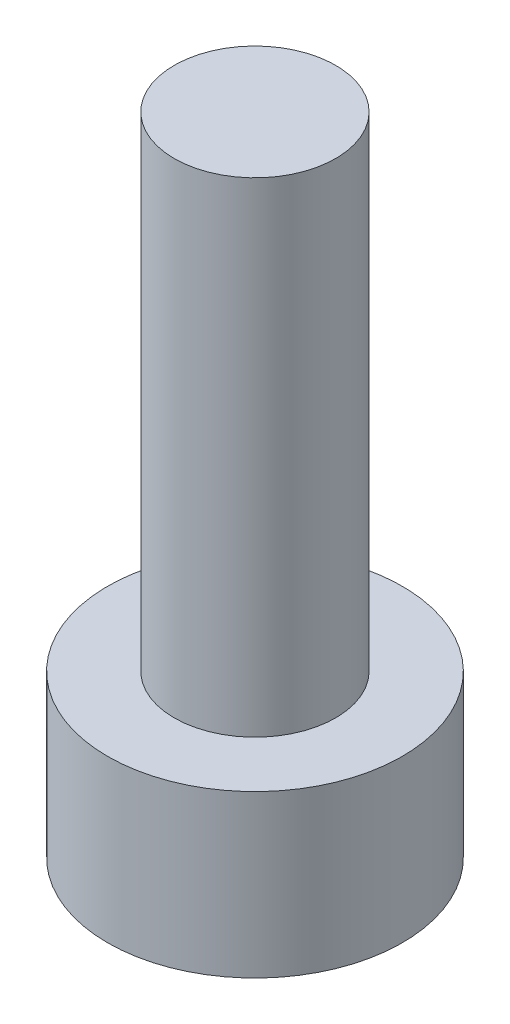
ISO-10303-21;
HEADER;
FILE_DESCRIPTION(('STEP AP214'),'2;1');
FILE_NAME('part.step','',(''),(''),'','','');
FILE_SCHEMA(('AUTOMOTIVE_DESIGN { 1 0 10303 214 1 1 1 1 }'));
ENDSEC;
DATA;
#1=APPLICATION_CONTEXT('core data for automotive mechanical design processes');
#2=APPLICATION_PROTOCOL_DEFINITION('international standard','automotive_design',2000,#1);
#3=PRODUCT_CONTEXT('',#1,'mechanical');
#4=PRODUCT('Part','Part','',(#3));
#5=PRODUCT_RELATED_PRODUCT_CATEGORY('part','',(#4));
#6=PRODUCT_DEFINITION_FORMATION('','',#4);
#7=PRODUCT_DEFINITION_CONTEXT('part definition',#1,'design');
#8=PRODUCT_DEFINITION('design','',#6,#7);
#9=PRODUCT_DEFINITION_SHAPE('','',#8);
#10=(LENGTH_UNIT() NAMED_UNIT(*) SI_UNIT(.MILLI.,.METRE.));
#11=(NAMED_UNIT(*) PLANE_ANGLE_UNIT() SI_UNIT($,.RADIAN.));
#12=(NAMED_UNIT(*) SI_UNIT($,.STERADIAN.) SOLID_ANGLE_UNIT());
#13=UNCERTAINTY_MEASURE_WITH_UNIT(LENGTH_MEASURE(1.E-05),#10,'distance_accuracy_value','');
#14=(GEOMETRIC_REPRESENTATION_CONTEXT(3) GLOBAL_UNCERTAINTY_ASSIGNED_CONTEXT((#13)) GLOBAL_UNIT_ASSIGNED_CONTEXT((#10,
#11,#12)) REPRESENTATION_CONTEXT('',''));
#15=CARTESIAN_POINT('',(0.,0.,0.));
#16=DIRECTION('',(0.,0.,1.));
#17=DIRECTION('',(1.,0.,0.));
#18=AXIS2_PLACEMENT_3D('',#15,#16,#17);
#19=CARTESIAN_POINT('',(0.,4.,0.));
#20=DIRECTION('',(0.,-1.,0.));
#21=DIRECTION('',(0.,0.,-1.));
#22=AXIS2_PLACEMENT_3D('',#19,#20,#21);
#23=CYLINDRICAL_SURFACE('',#22,3.65);
#24=CARTESIAN_POINT('',(0.,4.,0.));
#25=DIRECTION('',(0.,1.,0.));
#26=DIRECTION('',(0.,0.,1.));
#27=AXIS2_PLACEMENT_3D('',#24,#25,#26);
#28=CIRCLE('',#27,3.65);
#29=CARTESIAN_POINT('',(0.,4.,3.65));
#30=VERTEX_POINT('',#29);
#31=EDGE_CURVE('E42',#30,#30,#28,.T.);
#32=ORIENTED_EDGE('',*,*,#31,.F.);
#33=EDGE_LOOP('',(#32));
#34=FACE_BOUND('',#33,.T.);
#35=CARTESIAN_POINT('',(0.,0.,0.));
#36=DIRECTION('',(0.,1.,0.));
#37=DIRECTION('',(0.,0.,1.));
#38=AXIS2_PLACEMENT_3D('',#35,#36,#37);
#39=CIRCLE('',#38,3.65);
#40=CARTESIAN_POINT('',(0.,0.,3.65));
#41=VERTEX_POINT('',#40);
#42=EDGE_CURVE('E38',#41,#41,#39,.T.);
#43=ORIENTED_EDGE('',*,*,#42,.T.);
#44=EDGE_LOOP('',(#43));
#45=FACE_BOUND('',#44,.T.);
#46=ADVANCED_FACE('F35',(#34,#45),#23,.T.);
#47=CARTESIAN_POINT('',(0.,4.,0.));
#48=DIRECTION('',(0.,1.,0.));
#49=DIRECTION('',(0.,0.,1.));
#50=AXIS2_PLACEMENT_3D('',#47,#48,#49);
#51=PLANE('',#50);
#52=CARTESIAN_POINT('',(0.,4.,0.));
#53=DIRECTION('',(0.,1.,0.));
#54=DIRECTION('',(0.,0.,1.));
#55=AXIS2_PLACEMENT_3D('',#52,#53,#54);
#56=CIRCLE('',#55,2.);
#57=CARTESIAN_POINT('',(0.,4.,2.));
#58=VERTEX_POINT('',#57);
#59=EDGE_CURVE('E10',#58,#58,#56,.T.);
#60=ORIENTED_EDGE('',*,*,#59,.F.);
#61=EDGE_LOOP('',(#60));
#62=FACE_BOUND('',#61,.T.);
#63=ORIENTED_EDGE('',*,*,#31,.T.);
#64=EDGE_LOOP('',(#63));
#65=FACE_BOUND('',#64,.T.);
#66=ADVANCED_FACE('F59',(#62,#65),#51,.T.);
#67=CARTESIAN_POINT('',(0.,0.,0.));
#68=DIRECTION('',(0.,1.,0.));
#69=DIRECTION('',(0.,0.,1.));
#70=AXIS2_PLACEMENT_3D('',#67,#68,#69);
#71=PLANE('',#70);
#72=ORIENTED_EDGE('',*,*,#42,.F.);
#73=EDGE_LOOP('',(#72));
#74=FACE_BOUND('',#73,.T.);
#75=ADVANCED_FACE('F56',(#74),#71,.F.);
#76=CARTESIAN_POINT('',(0.,16.,0.));
#77=DIRECTION('',(0.,-1.,0.));
#78=DIRECTION('',(0.,0.,-1.));
#79=AXIS2_PLACEMENT_3D('',#76,#77,#78);
#80=CYLINDRICAL_SURFACE('',#79,2.);
#81=CARTESIAN_POINT('',(0.,16.,0.));
#82=DIRECTION('',(0.,1.,0.));
#83=DIRECTION('',(0.,0.,1.));
#84=AXIS2_PLACEMENT_3D('',#81,#82,#83);
#85=CIRCLE('',#84,2.);
#86=CARTESIAN_POINT('',(0.,16.,2.));
#87=VERTEX_POINT('',#86);
#88=EDGE_CURVE('E48',#87,#87,#85,.T.);
#89=ORIENTED_EDGE('',*,*,#88,.F.);
#90=EDGE_LOOP('',(#89));
#91=FACE_BOUND('',#90,.T.);
#92=ORIENTED_EDGE('',*,*,#59,.T.);
#93=EDGE_LOOP('',(#92));
#94=FACE_BOUND('',#93,.T.);
#95=ADVANCED_FACE('F58',(#91,#94),#80,.T.);
#96=CARTESIAN_POINT('',(0.,16.,0.));
#97=DIRECTION('',(0.,1.,0.));
#98=DIRECTION('',(0.,0.,1.));
#99=AXIS2_PLACEMENT_3D('',#96,#97,#98);
#100=PLANE('',#99);
#101=ORIENTED_EDGE('',*,*,#88,.T.);
#102=EDGE_LOOP('',(#101));
#103=FACE_BOUND('',#102,.T.);
#104=ADVANCED_FACE('F64',(#103),#100,.T.);
#105=CLOSED_SHELL('',(#46,#66,#75,#95,#104));
#106=MANIFOLD_SOLID_BREP('B2',#105);
#107=ADVANCED_BREP_SHAPE_REPRESENTATION('',(#18,#106),#14);
#108=SHAPE_DEFINITION_REPRESENTATION(#9,#107);
ENDSEC;
END-ISO-10303-21;
